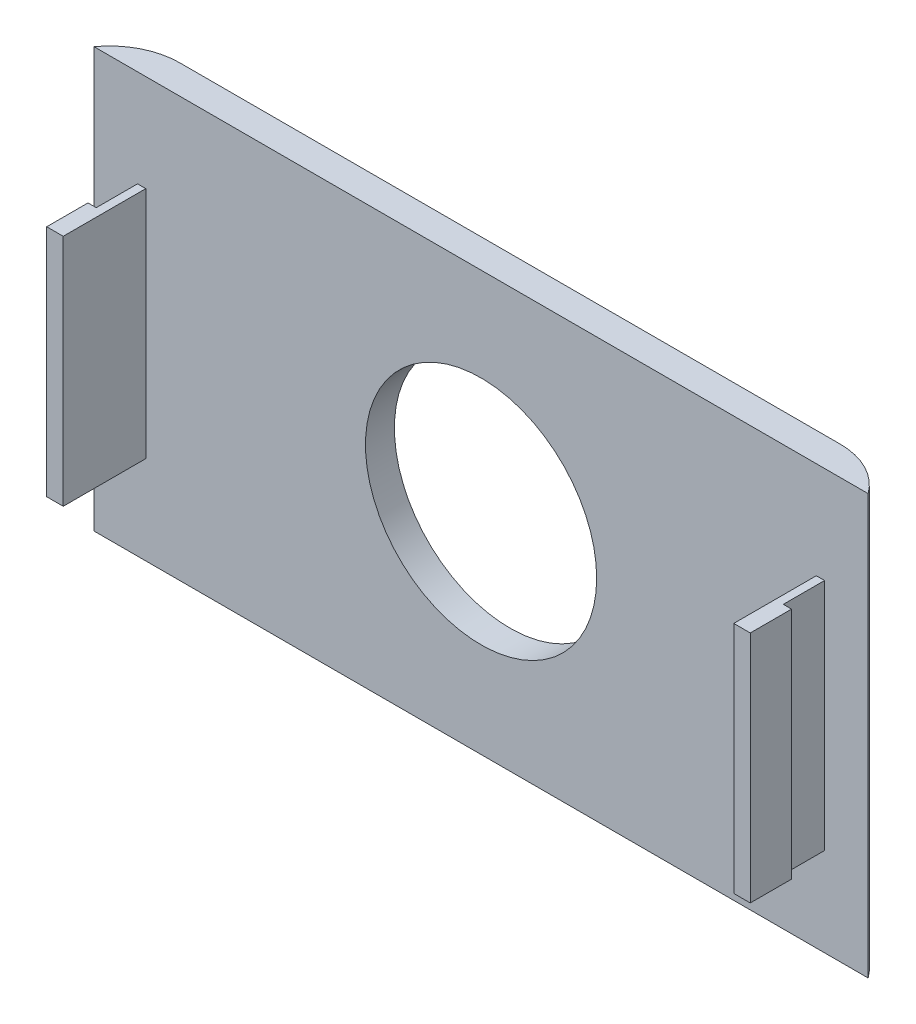
ISO-10303-21;
HEADER;
FILE_DESCRIPTION(('STEP AP214'),'2;1');
FILE_NAME('part.step','',(''),(''),'','','');
FILE_SCHEMA(('AUTOMOTIVE_DESIGN { 1 0 10303 214 1 1 1 1 }'));
ENDSEC;
DATA;
#1=APPLICATION_CONTEXT('core data for automotive mechanical design processes');
#2=APPLICATION_PROTOCOL_DEFINITION('international standard','automotive_design',2000,#1);
#3=PRODUCT_CONTEXT('',#1,'mechanical');
#4=PRODUCT('Part','Part','',(#3));
#5=PRODUCT_RELATED_PRODUCT_CATEGORY('part','',(#4));
#6=PRODUCT_DEFINITION_FORMATION('','',#4);
#7=PRODUCT_DEFINITION_CONTEXT('part definition',#1,'design');
#8=PRODUCT_DEFINITION('design','',#6,#7);
#9=PRODUCT_DEFINITION_SHAPE('','',#8);
#10=(LENGTH_UNIT() NAMED_UNIT(*) SI_UNIT(.MILLI.,.METRE.));
#11=(NAMED_UNIT(*) PLANE_ANGLE_UNIT() SI_UNIT($,.RADIAN.));
#12=(NAMED_UNIT(*) SI_UNIT($,.STERADIAN.) SOLID_ANGLE_UNIT());
#13=UNCERTAINTY_MEASURE_WITH_UNIT(LENGTH_MEASURE(1.E-05),#10,'distance_accuracy_value','');
#14=(GEOMETRIC_REPRESENTATION_CONTEXT(3) GLOBAL_UNCERTAINTY_ASSIGNED_CONTEXT((#13)) GLOBAL_UNIT_ASSIGNED_CONTEXT((#10,
#11,#12)) REPRESENTATION_CONTEXT('',''));
#15=CARTESIAN_POINT('',(0.,0.,0.));
#16=DIRECTION('',(0.,0.,1.));
#17=DIRECTION('',(1.,0.,0.));
#18=AXIS2_PLACEMENT_3D('',#15,#16,#17);
#19=CARTESIAN_POINT('',(-40.6,39.0508259488911,20.7509527022782));
#20=DIRECTION('',(0.,1.,0.));
#21=DIRECTION('',(0.,0.,1.));
#22=AXIS2_PLACEMENT_3D('',#19,#20,#21);
#23=PLANE('',#22);
#24=DIRECTION('',(0.,0.,1.));
#25=VECTOR('',#24,1.);
#26=CARTESIAN_POINT('',(-41.6,39.0508259488911,15.7509527022782));
#27=LINE('',#26,#25);
#28=CARTESIAN_POINT('',(-41.6,39.0508259488911,10.7509527022782));
#29=VERTEX_POINT('',#28);
#30=CARTESIAN_POINT('',(-41.6,39.0508259488911,15.7509527022782));
#31=VERTEX_POINT('',#30);
#32=EDGE_CURVE('E161',#29,#31,#27,.T.);
#33=ORIENTED_EDGE('',*,*,#32,.T.);
#34=DIRECTION('',(-1.,0.,0.));
#35=VECTOR('',#34,1.);
#36=CARTESIAN_POINT('',(-41.6,39.0508259488911,15.7509527022782));
#37=LINE('',#36,#35);
#38=CARTESIAN_POINT('',(-42.6,39.0508259488911,15.7509527022782));
#39=VERTEX_POINT('',#38);
#40=EDGE_CURVE('E147',#31,#39,#37,.T.);
#41=ORIENTED_EDGE('',*,*,#40,.T.);
#42=DIRECTION('',(0.,0.,-1.));
#43=VECTOR('',#42,1.);
#44=CARTESIAN_POINT('',(-42.5999999999999,39.0508259488911,20.7509527022782));
#45=LINE('',#44,#43);
#46=CARTESIAN_POINT('',(-42.5999999999999,39.0508259488911,20.7509527022782));
#47=VERTEX_POINT('',#46);
#48=EDGE_CURVE('E198',#47,#39,#45,.T.);
#49=ORIENTED_EDGE('',*,*,#48,.F.);
#50=DIRECTION('',(1.,0.,0.));
#51=VECTOR('',#50,1.);
#52=CARTESIAN_POINT('',(-40.6,39.0508259488911,20.7509527022782));
#53=LINE('',#52,#51);
#54=CARTESIAN_POINT('',(-40.6,39.0508259488911,20.7509527022782));
#55=VERTEX_POINT('',#54);
#56=EDGE_CURVE('E178',#47,#55,#53,.T.);
#57=ORIENTED_EDGE('',*,*,#56,.T.);
#58=DIRECTION('',(0.,0.,-1.));
#59=VECTOR('',#58,1.);
#60=CARTESIAN_POINT('',(-40.6,39.0508259488911,20.7509527022782));
#61=LINE('',#60,#59);
#62=CARTESIAN_POINT('',(-40.6,39.0508259488911,10.7509527022782));
#63=VERTEX_POINT('',#62);
#64=EDGE_CURVE('E200',#55,#63,#61,.T.);
#65=ORIENTED_EDGE('',*,*,#64,.T.);
#66=DIRECTION('',(1.,0.,0.));
#67=VECTOR('',#66,1.);
#68=CARTESIAN_POINT('',(-40.6,39.0508259488911,10.7509527022782));
#69=LINE('',#68,#67);
#70=EDGE_CURVE('E165',#29,#63,#69,.T.);
#71=ORIENTED_EDGE('',*,*,#70,.F.);
#72=EDGE_LOOP('',(#33,#41,#49,#57,#65,#71));
#73=FACE_BOUND('',#72,.T.);
#74=ADVANCED_FACE('F33',(#73),#23,.T.);
#75=CARTESIAN_POINT('',(-42.5999999999999,39.0508259488911,20.7509527022782));
#76=DIRECTION('',(-1.,0.,0.));
#77=DIRECTION('',(0.,0.,1.));
#78=AXIS2_PLACEMENT_3D('',#75,#76,#77);
#79=PLANE('',#78);
#80=ORIENTED_EDGE('',*,*,#48,.T.);
#81=DIRECTION('',(0.,-1.,0.));
#82=VECTOR('',#81,1.);
#83=CARTESIAN_POINT('',(-42.6,39.0508259488911,15.7509527022782));
#84=LINE('',#83,#82);
#85=CARTESIAN_POINT('',(-42.6,10.7314846602549,15.7509527022782));
#86=VERTEX_POINT('',#85);
#87=EDGE_CURVE('E153',#39,#86,#84,.T.);
#88=ORIENTED_EDGE('',*,*,#87,.T.);
#89=DIRECTION('',(0.,0.,-1.));
#90=VECTOR('',#89,1.);
#91=CARTESIAN_POINT('',(-42.5999999999999,10.7314846602549,20.7509527022782));
#92=LINE('',#91,#90);
#93=CARTESIAN_POINT('',(-42.5999999999999,10.7314846602549,20.7509527022782));
#94=VERTEX_POINT('',#93);
#95=EDGE_CURVE('E195',#94,#86,#92,.T.);
#96=ORIENTED_EDGE('',*,*,#95,.F.);
#97=DIRECTION('',(0.,1.,0.));
#98=VECTOR('',#97,1.);
#99=CARTESIAN_POINT('',(-42.5999999999999,39.0508259488911,20.7509527022782));
#100=LINE('',#99,#98);
#101=EDGE_CURVE('E182',#94,#47,#100,.T.);
#102=ORIENTED_EDGE('',*,*,#101,.T.);
#103=EDGE_LOOP('',(#80,#88,#96,#102));
#104=FACE_BOUND('',#103,.T.);
#105=ADVANCED_FACE('F303',(#104),#79,.T.);
#106=CARTESIAN_POINT('',(-40.6,10.7314846602549,20.7509527022782));
#107=DIRECTION('',(0.,-1.,0.));
#108=DIRECTION('',(0.,0.,-1.));
#109=AXIS2_PLACEMENT_3D('',#106,#107,#108);
#110=PLANE('',#109);
#111=ORIENTED_EDGE('',*,*,#95,.T.);
#112=DIRECTION('',(-1.,0.,0.));
#113=VECTOR('',#112,1.);
#114=CARTESIAN_POINT('',(-41.6,10.7314846602549,15.7509527022782));
#115=LINE('',#114,#113);
#116=CARTESIAN_POINT('',(-41.6,10.7314846602549,15.7509527022782));
#117=VERTEX_POINT('',#116);
#118=EDGE_CURVE('E157',#117,#86,#115,.T.);
#119=ORIENTED_EDGE('',*,*,#118,.F.);
#120=DIRECTION('',(0.,0.,-1.));
#121=VECTOR('',#120,1.);
#122=CARTESIAN_POINT('',(-41.6,10.7314846602549,15.7509527022782));
#123=LINE('',#122,#121);
#124=CARTESIAN_POINT('',(-41.6,10.7314846602549,10.7509527022782));
#125=VERTEX_POINT('',#124);
#126=EDGE_CURVE('E158',#117,#125,#123,.T.);
#127=ORIENTED_EDGE('',*,*,#126,.T.);
#128=DIRECTION('',(-1.,0.,0.));
#129=VECTOR('',#128,1.);
#130=CARTESIAN_POINT('',(-40.6,10.7314846602549,10.7509527022782));
#131=LINE('',#130,#129);
#132=CARTESIAN_POINT('',(-40.6,10.7314846602549,10.7509527022782));
#133=VERTEX_POINT('',#132);
#134=EDGE_CURVE('E179',#133,#125,#131,.T.);
#135=ORIENTED_EDGE('',*,*,#134,.F.);
#136=DIRECTION('',(0.,0.,-1.));
#137=VECTOR('',#136,1.);
#138=CARTESIAN_POINT('',(-40.6,10.7314846602549,20.7509527022782));
#139=LINE('',#138,#137);
#140=CARTESIAN_POINT('',(-40.6,10.7314846602549,20.7509527022782));
#141=VERTEX_POINT('',#140);
#142=EDGE_CURVE('E188',#141,#133,#139,.T.);
#143=ORIENTED_EDGE('',*,*,#142,.F.);
#144=DIRECTION('',(-1.,0.,0.));
#145=VECTOR('',#144,1.);
#146=CARTESIAN_POINT('',(-40.6,10.7314846602549,20.7509527022782));
#147=LINE('',#146,#145);
#148=EDGE_CURVE('E185',#141,#94,#147,.T.);
#149=ORIENTED_EDGE('',*,*,#148,.T.);
#150=EDGE_LOOP('',(#111,#119,#127,#135,#143,#149));
#151=FACE_BOUND('',#150,.T.);
#152=ADVANCED_FACE('F308',(#151),#110,.T.);
#153=CARTESIAN_POINT('',(-46.8745553102538,50.8,10.7509527022781));
#154=DIRECTION('',(0.,0.,-1.));
#155=DIRECTION('',(-1.,0.,0.));
#156=AXIS2_PLACEMENT_3D('',#153,#154,#155);
#157=PLANE('',#156);
#158=CARTESIAN_POINT('',(0.,25.5,10.7509527022781));
#159=DIRECTION('',(0.,0.,1.));
#160=DIRECTION('',(1.,0.,0.));
#161=AXIS2_PLACEMENT_3D('',#158,#159,#160);
#162=CIRCLE('',#161,14.);
#163=CARTESIAN_POINT('',(14.,25.5,10.7509527022781));
#164=VERTEX_POINT('',#163);
#165=EDGE_CURVE('E358',#164,#164,#162,.T.);
#166=ORIENTED_EDGE('',*,*,#165,.F.);
#167=EDGE_LOOP('',(#166));
#168=FACE_BOUND('',#167,.T.);
#169=DIRECTION('',(0.,1.,0.));
#170=VECTOR('',#169,1.);
#171=CARTESIAN_POINT('',(-41.6,39.0508259488911,10.7509527022782));
#172=LINE('',#171,#170);
#173=EDGE_CURVE('E48',#125,#29,#172,.T.);
#174=ORIENTED_EDGE('',*,*,#173,.T.);
#175=ORIENTED_EDGE('',*,*,#70,.T.);
#176=DIRECTION('',(0.,-1.,0.));
#177=VECTOR('',#176,1.);
#178=CARTESIAN_POINT('',(-40.6,39.0508259488911,10.7509527022782));
#179=LINE('',#178,#177);
#180=EDGE_CURVE('E173',#63,#133,#179,.T.);
#181=ORIENTED_EDGE('',*,*,#180,.T.);
#182=ORIENTED_EDGE('',*,*,#134,.T.);
#183=EDGE_LOOP('',(#174,#175,#181,#182));
#184=FACE_BOUND('',#183,.T.);
#185=DIRECTION('',(1.,0.,0.));
#186=VECTOR('',#185,1.);
#187=CARTESIAN_POINT('',(-46.8745553102538,0.,10.7509527022781));
#188=LINE('',#187,#186);
#189=CARTESIAN_POINT('',(-46.8745553102538,0.,10.7509527022781));
#190=VERTEX_POINT('',#189);
#191=CARTESIAN_POINT('',(46.8745553102538,0.,10.7509527022781));
#192=VERTEX_POINT('',#191);
#193=EDGE_CURVE('E251',#190,#192,#188,.T.);
#194=ORIENTED_EDGE('',*,*,#193,.T.);
#195=DIRECTION('',(0.,-1.,0.));
#196=VECTOR('',#195,1.);
#197=CARTESIAN_POINT('',(46.8745553102538,50.8,10.7509527022781));
#198=LINE('',#197,#196);
#199=CARTESIAN_POINT('',(46.8745553102538,50.8,10.7509527022781));
#200=VERTEX_POINT('',#199);
#201=EDGE_CURVE('E257',#200,#192,#198,.T.);
#202=ORIENTED_EDGE('',*,*,#201,.F.);
#203=DIRECTION('',(1.,0.,0.));
#204=VECTOR('',#203,1.);
#205=CARTESIAN_POINT('',(-46.8745553102538,50.8,10.7509527022781));
#206=LINE('',#205,#204);
#207=CARTESIAN_POINT('',(-46.8745553102538,50.8,10.7509527022781));
#208=VERTEX_POINT('',#207);
#209=EDGE_CURVE('E255',#208,#200,#206,.T.);
#210=ORIENTED_EDGE('',*,*,#209,.F.);
#211=DIRECTION('',(0.,-1.,0.));
#212=VECTOR('',#211,1.);
#213=CARTESIAN_POINT('',(-46.8745553102538,50.8,10.7509527022781));
#214=LINE('',#213,#212);
#215=EDGE_CURVE('E267',#208,#190,#214,.T.);
#216=ORIENTED_EDGE('',*,*,#215,.T.);
#217=EDGE_LOOP('',(#194,#202,#210,#216));
#218=FACE_BOUND('',#217,.T.);
#219=DIRECTION('',(0.,-1.,0.));
#220=VECTOR('',#219,1.);
#221=CARTESIAN_POINT('',(40.6,39.0508259488911,10.7509527022781));
#222=LINE('',#221,#220);
#223=CARTESIAN_POINT('',(40.6,39.0508259488911,10.7509527022781));
#224=VERTEX_POINT('',#223);
#225=CARTESIAN_POINT('',(40.6,10.7314846602549,10.7509527022781));
#226=VERTEX_POINT('',#225);
#227=EDGE_CURVE('E215',#224,#226,#222,.T.);
#228=ORIENTED_EDGE('',*,*,#227,.F.);
#229=DIRECTION('',(-1.,0.,0.));
#230=VECTOR('',#229,1.);
#231=CARTESIAN_POINT('',(40.6,39.0508259488911,10.7509527022781));
#232=LINE('',#231,#230);
#233=CARTESIAN_POINT('',(41.6,39.0508259488911,10.7509527022781));
#234=VERTEX_POINT('',#233);
#235=EDGE_CURVE('E222',#234,#224,#232,.T.);
#236=ORIENTED_EDGE('',*,*,#235,.F.);
#237=DIRECTION('',(0.,1.,0.));
#238=VECTOR('',#237,1.);
#239=CARTESIAN_POINT('',(41.6,39.0508259488911,10.7509527022781));
#240=LINE('',#239,#238);
#241=CARTESIAN_POINT('',(41.6,10.7314846602549,10.7509527022781));
#242=VERTEX_POINT('',#241);
#243=EDGE_CURVE('E56',#242,#234,#240,.T.);
#244=ORIENTED_EDGE('',*,*,#243,.F.);
#245=DIRECTION('',(1.,0.,0.));
#246=VECTOR('',#245,1.);
#247=CARTESIAN_POINT('',(40.6,10.7314846602549,10.7509527022781));
#248=LINE('',#247,#246);
#249=EDGE_CURVE('E231',#226,#242,#248,.T.);
#250=ORIENTED_EDGE('',*,*,#249,.F.);
#251=EDGE_LOOP('',(#228,#236,#244,#250));
#252=FACE_BOUND('',#251,.T.);
#253=ADVANCED_FACE('F283',(#168,#184,#218,#252),#157,.F.);
#254=CARTESIAN_POINT('',(40.,50.8,15.7500005704625));
#255=DIRECTION('',(0.,-1.,0.));
#256=DIRECTION('',(0.,0.,-1.));
#257=AXIS2_PLACEMENT_3D('',#254,#255,#256);
#258=CYLINDRICAL_SURFACE('',#257,8.49999942953751);
#259=CARTESIAN_POINT('',(40.,0.,15.7500005704625));
#260=DIRECTION('',(0.,1.,0.));
#261=DIRECTION('',(0.,0.,1.));
#262=AXIS2_PLACEMENT_3D('',#259,#260,#261);
#263=CIRCLE('',#262,8.49999942953751);
#264=CARTESIAN_POINT('',(40.,0.,7.25000114092498));
#265=VERTEX_POINT('',#264);
#266=EDGE_CURVE('E246',#192,#265,#263,.T.);
#267=ORIENTED_EDGE('',*,*,#266,.T.);
#268=DIRECTION('',(0.,-1.,0.));
#269=VECTOR('',#268,1.);
#270=CARTESIAN_POINT('',(40.,50.8,7.25000114092498));
#271=LINE('',#270,#269);
#272=CARTESIAN_POINT('',(40.,50.8,7.25000114092498));
#273=VERTEX_POINT('',#272);
#274=EDGE_CURVE('E11',#273,#265,#271,.T.);
#275=ORIENTED_EDGE('',*,*,#274,.F.);
#276=CARTESIAN_POINT('',(40.,50.8,15.7500005704625));
#277=DIRECTION('',(0.,1.,0.));
#278=DIRECTION('',(0.,0.,1.));
#279=AXIS2_PLACEMENT_3D('',#276,#277,#278);
#280=CIRCLE('',#279,8.49999942953751);
#281=EDGE_CURVE('E247',#200,#273,#280,.T.);
#282=ORIENTED_EDGE('',*,*,#281,.F.);
#283=ORIENTED_EDGE('',*,*,#201,.T.);
#284=EDGE_LOOP('',(#267,#275,#282,#283));
#285=FACE_BOUND('',#284,.T.);
#286=ADVANCED_FACE('F35',(#285),#258,.T.);
#287=CARTESIAN_POINT('',(-40.,50.8,7.25000114092498));
#288=DIRECTION('',(0.,0.,1.));
#289=DIRECTION('',(1.,0.,0.));
#290=AXIS2_PLACEMENT_3D('',#287,#288,#289);
#291=PLANE('',#290);
#292=CARTESIAN_POINT('',(0.,25.5,7.25000114092498));
#293=DIRECTION('',(0.,0.,1.));
#294=DIRECTION('',(1.,0.,0.));
#295=AXIS2_PLACEMENT_3D('',#292,#293,#294);
#296=CIRCLE('',#295,14.);
#297=CARTESIAN_POINT('',(14.,25.5,7.25000114092498));
#298=VERTEX_POINT('',#297);
#299=EDGE_CURVE('E172',#298,#298,#296,.T.);
#300=ORIENTED_EDGE('',*,*,#299,.T.);
#301=EDGE_LOOP('',(#300));
#302=FACE_BOUND('',#301,.T.);
#303=DIRECTION('',(-1.,0.,0.));
#304=VECTOR('',#303,1.);
#305=CARTESIAN_POINT('',(-40.,0.,7.25000114092498));
#306=LINE('',#305,#304);
#307=CARTESIAN_POINT('',(-40.,0.,7.25000114092498));
#308=VERTEX_POINT('',#307);
#309=EDGE_CURVE('E260',#265,#308,#306,.T.);
#310=ORIENTED_EDGE('',*,*,#309,.T.);
#311=DIRECTION('',(0.,-1.,0.));
#312=VECTOR('',#311,1.);
#313=CARTESIAN_POINT('',(-40.,50.8,7.25000114092498));
#314=LINE('',#313,#312);
#315=CARTESIAN_POINT('',(-40.,50.8,7.25000114092498));
#316=VERTEX_POINT('',#315);
#317=EDGE_CURVE('E41',#316,#308,#314,.T.);
#318=ORIENTED_EDGE('',*,*,#317,.F.);
#319=DIRECTION('',(-1.,0.,0.));
#320=VECTOR('',#319,1.);
#321=CARTESIAN_POINT('',(-40.,50.8,7.25000114092498));
#322=LINE('',#321,#320);
#323=EDGE_CURVE('E250',#273,#316,#322,.T.);
#324=ORIENTED_EDGE('',*,*,#323,.F.);
#325=ORIENTED_EDGE('',*,*,#274,.T.);
#326=EDGE_LOOP('',(#310,#318,#324,#325));
#327=FACE_BOUND('',#326,.T.);
#328=ADVANCED_FACE('F291',(#302,#327),#291,.F.);
#329=CARTESIAN_POINT('',(-40.,50.8,15.7500005704625));
#330=DIRECTION('',(0.,-1.,0.));
#331=DIRECTION('',(0.,0.,-1.));
#332=AXIS2_PLACEMENT_3D('',#329,#330,#331);
#333=CYLINDRICAL_SURFACE('',#332,8.49999942953751);
#334=CARTESIAN_POINT('',(-40.,0.,15.7500005704625));
#335=DIRECTION('',(0.,1.,0.));
#336=DIRECTION('',(0.,0.,-1.));
#337=AXIS2_PLACEMENT_3D('',#334,#335,#336);
#338=CIRCLE('',#337,8.49999942953751);
#339=EDGE_CURVE('E262',#308,#190,#338,.T.);
#340=ORIENTED_EDGE('',*,*,#339,.T.);
#341=ORIENTED_EDGE('',*,*,#215,.F.);
#342=CARTESIAN_POINT('',(-40.,50.8,15.7500005704625));
#343=DIRECTION('',(0.,1.,0.));
#344=DIRECTION('',(0.,0.,-1.));
#345=AXIS2_PLACEMENT_3D('',#342,#343,#344);
#346=CIRCLE('',#345,8.49999942953751);
#347=EDGE_CURVE('E253',#316,#208,#346,.T.);
#348=ORIENTED_EDGE('',*,*,#347,.F.);
#349=ORIENTED_EDGE('',*,*,#317,.T.);
#350=EDGE_LOOP('',(#340,#341,#348,#349));
#351=FACE_BOUND('',#350,.T.);
#352=ADVANCED_FACE('F274',(#351),#333,.T.);
#353=CARTESIAN_POINT('',(40.,50.8,15.7500005704625));
#354=DIRECTION('',(0.,1.,0.));
#355=DIRECTION('',(0.,0.,1.));
#356=AXIS2_PLACEMENT_3D('',#353,#354,#355);
#357=PLANE('',#356);
#358=ORIENTED_EDGE('',*,*,#281,.T.);
#359=ORIENTED_EDGE('',*,*,#323,.T.);
#360=ORIENTED_EDGE('',*,*,#347,.T.);
#361=ORIENTED_EDGE('',*,*,#209,.T.);
#362=EDGE_LOOP('',(#358,#359,#360,#361));
#363=FACE_BOUND('',#362,.T.);
#364=ADVANCED_FACE('F290',(#363),#357,.T.);
#365=CARTESIAN_POINT('',(40.,0.,15.7500005704625));
#366=DIRECTION('',(0.,1.,0.));
#367=DIRECTION('',(0.,0.,1.));
#368=AXIS2_PLACEMENT_3D('',#365,#366,#367);
#369=PLANE('',#368);
#370=ORIENTED_EDGE('',*,*,#266,.F.);
#371=ORIENTED_EDGE('',*,*,#193,.F.);
#372=ORIENTED_EDGE('',*,*,#339,.F.);
#373=ORIENTED_EDGE('',*,*,#309,.F.);
#374=EDGE_LOOP('',(#370,#371,#372,#373));
#375=FACE_BOUND('',#374,.T.);
#376=ADVANCED_FACE('F280',(#375),#369,.F.);
#377=CARTESIAN_POINT('',(40.6,39.0508259488911,20.7509527022781));
#378=DIRECTION('',(1.,0.,0.));
#379=DIRECTION('',(0.,1.,0.));
#380=AXIS2_PLACEMENT_3D('',#377,#378,#379);
#381=PLANE('',#380);
#382=ORIENTED_EDGE('',*,*,#227,.T.);
#383=DIRECTION('',(0.,0.,-1.));
#384=VECTOR('',#383,1.);
#385=CARTESIAN_POINT('',(40.6,10.7314846602549,20.7509527022781));
#386=LINE('',#385,#384);
#387=CARTESIAN_POINT('',(40.6,10.7314846602549,20.7509527022781));
#388=VERTEX_POINT('',#387);
#389=EDGE_CURVE('E243',#388,#226,#386,.T.);
#390=ORIENTED_EDGE('',*,*,#389,.F.);
#391=DIRECTION('',(0.,-1.,0.));
#392=VECTOR('',#391,1.);
#393=CARTESIAN_POINT('',(40.6,39.0508259488911,20.7509527022781));
#394=LINE('',#393,#392);
#395=CARTESIAN_POINT('',(40.6,39.0508259488911,20.7509527022781));
#396=VERTEX_POINT('',#395);
#397=EDGE_CURVE('E218',#396,#388,#394,.T.);
#398=ORIENTED_EDGE('',*,*,#397,.F.);
#399=DIRECTION('',(0.,0.,-1.));
#400=VECTOR('',#399,1.);
#401=CARTESIAN_POINT('',(40.6,39.0508259488911,20.7509527022781));
#402=LINE('',#401,#400);
#403=EDGE_CURVE('E228',#396,#224,#402,.T.);
#404=ORIENTED_EDGE('',*,*,#403,.T.);
#405=EDGE_LOOP('',(#382,#390,#398,#404));
#406=FACE_BOUND('',#405,.T.);
#407=ADVANCED_FACE('F340',(#406),#381,.F.);
#408=CARTESIAN_POINT('',(40.6,10.7314846602549,20.7509527022781));
#409=DIRECTION('',(0.,1.,0.));
#410=DIRECTION('',(0.,0.,1.));
#411=AXIS2_PLACEMENT_3D('',#408,#409,#410);
#412=PLANE('',#411);
#413=DIRECTION('',(0.,0.,-1.));
#414=VECTOR('',#413,1.);
#415=CARTESIAN_POINT('',(41.6,10.7314846602549,15.7509527022781));
#416=LINE('',#415,#414);
#417=CARTESIAN_POINT('',(41.6,10.7314846602549,15.7509527022781));
#418=VERTEX_POINT('',#417);
#419=EDGE_CURVE('E206',#418,#242,#416,.T.);
#420=ORIENTED_EDGE('',*,*,#419,.F.);
#421=DIRECTION('',(1.,0.,0.));
#422=VECTOR('',#421,1.);
#423=CARTESIAN_POINT('',(41.6,10.7314846602549,15.7509527022781));
#424=LINE('',#423,#422);
#425=CARTESIAN_POINT('',(42.6,10.7314846602549,15.7509527022781));
#426=VERTEX_POINT('',#425);
#427=EDGE_CURVE('E211',#418,#426,#424,.T.);
#428=ORIENTED_EDGE('',*,*,#427,.T.);
#429=DIRECTION('',(0.,0.,-1.));
#430=VECTOR('',#429,1.);
#431=CARTESIAN_POINT('',(42.6,10.7314846602549,20.7509527022781));
#432=LINE('',#431,#430);
#433=CARTESIAN_POINT('',(42.6,10.7314846602549,20.7509527022781));
#434=VERTEX_POINT('',#433);
#435=EDGE_CURVE('E240',#434,#426,#432,.T.);
#436=ORIENTED_EDGE('',*,*,#435,.F.);
#437=DIRECTION('',(1.,0.,0.));
#438=VECTOR('',#437,1.);
#439=CARTESIAN_POINT('',(40.6,10.7314846602549,20.7509527022781));
#440=LINE('',#439,#438);
#441=EDGE_CURVE('E221',#388,#434,#440,.T.);
#442=ORIENTED_EDGE('',*,*,#441,.F.);
#443=ORIENTED_EDGE('',*,*,#389,.T.);
#444=ORIENTED_EDGE('',*,*,#249,.T.);
#445=EDGE_LOOP('',(#420,#428,#436,#442,#443,#444));
#446=FACE_BOUND('',#445,.T.);
#447=ADVANCED_FACE('F336',(#446),#412,.F.);
#448=CARTESIAN_POINT('',(42.6,39.0508259488911,20.7509527022781));
#449=DIRECTION('',(-1.,0.,0.));
#450=DIRECTION('',(0.,0.,1.));
#451=AXIS2_PLACEMENT_3D('',#448,#449,#450);
#452=PLANE('',#451);
#453=ORIENTED_EDGE('',*,*,#435,.T.);
#454=DIRECTION('',(0.,-1.,0.));
#455=VECTOR('',#454,1.);
#456=CARTESIAN_POINT('',(42.6,39.0508259488911,15.7509527022781));
#457=LINE('',#456,#455);
#458=CARTESIAN_POINT('',(42.6,39.0508259488911,15.7509527022781));
#459=VERTEX_POINT('',#458);
#460=EDGE_CURVE('E202',#459,#426,#457,.T.);
#461=ORIENTED_EDGE('',*,*,#460,.F.);
#462=DIRECTION('',(0.,0.,-1.));
#463=VECTOR('',#462,1.);
#464=CARTESIAN_POINT('',(42.6,39.0508259488911,20.7509527022781));
#465=LINE('',#464,#463);
#466=CARTESIAN_POINT('',(42.6,39.0508259488911,20.7509527022781));
#467=VERTEX_POINT('',#466);
#468=EDGE_CURVE('E237',#467,#459,#465,.T.);
#469=ORIENTED_EDGE('',*,*,#468,.F.);
#470=DIRECTION('',(0.,1.,0.));
#471=VECTOR('',#470,1.);
#472=CARTESIAN_POINT('',(42.6,39.0508259488911,20.7509527022781));
#473=LINE('',#472,#471);
#474=EDGE_CURVE('E224',#434,#467,#473,.T.);
#475=ORIENTED_EDGE('',*,*,#474,.F.);
#476=EDGE_LOOP('',(#453,#461,#469,#475));
#477=FACE_BOUND('',#476,.T.);
#478=ADVANCED_FACE('F332',(#477),#452,.F.);
#479=CARTESIAN_POINT('',(40.6,39.0508259488911,20.7509527022781));
#480=DIRECTION('',(0.,-1.,0.));
#481=DIRECTION('',(0.,0.,-1.));
#482=AXIS2_PLACEMENT_3D('',#479,#480,#481);
#483=PLANE('',#482);
#484=ORIENTED_EDGE('',*,*,#468,.T.);
#485=DIRECTION('',(1.,0.,0.));
#486=VECTOR('',#485,1.);
#487=CARTESIAN_POINT('',(41.6,39.0508259488911,15.7509527022781));
#488=LINE('',#487,#486);
#489=CARTESIAN_POINT('',(41.6,39.0508259488911,15.7509527022781));
#490=VERTEX_POINT('',#489);
#491=EDGE_CURVE('E213',#490,#459,#488,.T.);
#492=ORIENTED_EDGE('',*,*,#491,.F.);
#493=DIRECTION('',(0.,0.,1.));
#494=VECTOR('',#493,1.);
#495=CARTESIAN_POINT('',(41.6,39.0508259488911,15.7509527022781));
#496=LINE('',#495,#494);
#497=EDGE_CURVE('E209',#234,#490,#496,.T.);
#498=ORIENTED_EDGE('',*,*,#497,.F.);
#499=ORIENTED_EDGE('',*,*,#235,.T.);
#500=ORIENTED_EDGE('',*,*,#403,.F.);
#501=DIRECTION('',(-1.,0.,0.));
#502=VECTOR('',#501,1.);
#503=CARTESIAN_POINT('',(40.6,39.0508259488911,20.7509527022781));
#504=LINE('',#503,#502);
#505=EDGE_CURVE('E226',#467,#396,#504,.T.);
#506=ORIENTED_EDGE('',*,*,#505,.F.);
#507=EDGE_LOOP('',(#484,#492,#498,#499,#500,#506));
#508=FACE_BOUND('',#507,.T.);
#509=ADVANCED_FACE('F328',(#508),#483,.F.);
#510=CARTESIAN_POINT('',(0.,0.,20.7509527022781));
#511=DIRECTION('',(0.,0.,1.));
#512=DIRECTION('',(1.,0.,0.));
#513=AXIS2_PLACEMENT_3D('',#510,#511,#512);
#514=PLANE('',#513);
#515=ORIENTED_EDGE('',*,*,#397,.T.);
#516=ORIENTED_EDGE('',*,*,#441,.T.);
#517=ORIENTED_EDGE('',*,*,#474,.T.);
#518=ORIENTED_EDGE('',*,*,#505,.T.);
#519=EDGE_LOOP('',(#515,#516,#517,#518));
#520=FACE_BOUND('',#519,.T.);
#521=ADVANCED_FACE('F324',(#520),#514,.T.);
#522=CARTESIAN_POINT('',(41.6,39.0508259488911,15.7509527022781));
#523=DIRECTION('',(0.,0.,1.));
#524=DIRECTION('',(1.,0.,0.));
#525=AXIS2_PLACEMENT_3D('',#522,#523,#524);
#526=PLANE('',#525);
#527=ORIENTED_EDGE('',*,*,#460,.T.);
#528=ORIENTED_EDGE('',*,*,#427,.F.);
#529=DIRECTION('',(0.,-1.,0.));
#530=VECTOR('',#529,1.);
#531=CARTESIAN_POINT('',(41.6,39.0508259488911,15.7509527022781));
#532=LINE('',#531,#530);
#533=EDGE_CURVE('E203',#490,#418,#532,.T.);
#534=ORIENTED_EDGE('',*,*,#533,.F.);
#535=ORIENTED_EDGE('',*,*,#491,.T.);
#536=EDGE_LOOP('',(#527,#528,#534,#535));
#537=FACE_BOUND('',#536,.T.);
#538=ADVANCED_FACE('F321',(#537),#526,.F.);
#539=CARTESIAN_POINT('',(41.6,0.,0.));
#540=DIRECTION('',(1.,0.,0.));
#541=DIRECTION('',(0.,0.,-1.));
#542=AXIS2_PLACEMENT_3D('',#539,#540,#541);
#543=PLANE('',#542);
#544=ORIENTED_EDGE('',*,*,#533,.T.);
#545=ORIENTED_EDGE('',*,*,#419,.T.);
#546=ORIENTED_EDGE('',*,*,#243,.T.);
#547=ORIENTED_EDGE('',*,*,#497,.T.);
#548=EDGE_LOOP('',(#544,#545,#546,#547));
#549=FACE_BOUND('',#548,.T.);
#550=ADVANCED_FACE('F317',(#549),#543,.T.);
#551=CARTESIAN_POINT('',(-40.6,39.0508259488911,20.7509527022782));
#552=DIRECTION('',(1.,0.,0.));
#553=DIRECTION('',(0.,0.,-1.));
#554=AXIS2_PLACEMENT_3D('',#551,#552,#553);
#555=PLANE('',#554);
#556=ORIENTED_EDGE('',*,*,#180,.F.);
#557=ORIENTED_EDGE('',*,*,#64,.F.);
#558=DIRECTION('',(0.,-1.,0.));
#559=VECTOR('',#558,1.);
#560=CARTESIAN_POINT('',(-40.6,39.0508259488911,20.7509527022782));
#561=LINE('',#560,#559);
#562=EDGE_CURVE('E175',#55,#141,#561,.T.);
#563=ORIENTED_EDGE('',*,*,#562,.T.);
#564=ORIENTED_EDGE('',*,*,#142,.T.);
#565=EDGE_LOOP('',(#556,#557,#563,#564));
#566=FACE_BOUND('',#565,.T.);
#567=ADVANCED_FACE('F313',(#566),#555,.T.);
#568=CARTESIAN_POINT('',(0.,0.,20.7509527022781));
#569=DIRECTION('',(0.,0.,1.));
#570=DIRECTION('',(-1.,0.,0.));
#571=AXIS2_PLACEMENT_3D('',#568,#569,#570);
#572=PLANE('',#571);
#573=ORIENTED_EDGE('',*,*,#562,.F.);
#574=ORIENTED_EDGE('',*,*,#56,.F.);
#575=ORIENTED_EDGE('',*,*,#101,.F.);
#576=ORIENTED_EDGE('',*,*,#148,.F.);
#577=EDGE_LOOP('',(#573,#574,#575,#576));
#578=FACE_BOUND('',#577,.T.);
#579=ADVANCED_FACE('F316',(#578),#572,.T.);
#580=CARTESIAN_POINT('',(-41.6,39.0508259488911,15.7509527022782));
#581=DIRECTION('',(0.,0.,-1.));
#582=DIRECTION('',(-1.,0.,0.));
#583=AXIS2_PLACEMENT_3D('',#580,#581,#582);
#584=PLANE('',#583);
#585=ORIENTED_EDGE('',*,*,#87,.F.);
#586=ORIENTED_EDGE('',*,*,#40,.F.);
#587=DIRECTION('',(0.,-1.,0.));
#588=VECTOR('',#587,1.);
#589=CARTESIAN_POINT('',(-41.6,39.0508259488911,15.7509527022782));
#590=LINE('',#589,#588);
#591=EDGE_CURVE('E150',#31,#117,#590,.T.);
#592=ORIENTED_EDGE('',*,*,#591,.T.);
#593=ORIENTED_EDGE('',*,*,#118,.T.);
#594=EDGE_LOOP('',(#585,#586,#592,#593));
#595=FACE_BOUND('',#594,.T.);
#596=ADVANCED_FACE('F149',(#595),#584,.T.);
#597=CARTESIAN_POINT('',(-41.6,0.,1.07119668199419E-13));
#598=DIRECTION('',(-1.,0.,0.));
#599=DIRECTION('',(0.,0.,-1.));
#600=AXIS2_PLACEMENT_3D('',#597,#598,#599);
#601=PLANE('',#600);
#602=ORIENTED_EDGE('',*,*,#591,.F.);
#603=ORIENTED_EDGE('',*,*,#32,.F.);
#604=ORIENTED_EDGE('',*,*,#173,.F.);
#605=ORIENTED_EDGE('',*,*,#126,.F.);
#606=EDGE_LOOP('',(#602,#603,#604,#605));
#607=FACE_BOUND('',#606,.T.);
#608=ADVANCED_FACE('F160',(#607),#601,.T.);
#609=CARTESIAN_POINT('',(0.,25.5,7.25000114092498));
#610=DIRECTION('',(0.,0.,1.));
#611=DIRECTION('',(1.,0.,0.));
#612=AXIS2_PLACEMENT_3D('',#609,#610,#611);
#613=CYLINDRICAL_SURFACE('',#612,14.);
#614=CARTESIAN_POINT('',(14.,25.5,7.25000114092498));
#615=CARTESIAN_POINT('',(14.,25.5,7.28646938635574));
#616=CARTESIAN_POINT('',(14.,25.5,7.3229376317865));
#617=CARTESIAN_POINT('',(14.,25.5,7.39587412264802));
#618=CARTESIAN_POINT('',(14.,25.5,7.43234236807879));
#619=CARTESIAN_POINT('',(14.,25.5,7.50527885894031));
#620=CARTESIAN_POINT('',(14.,25.5,7.54174710437107));
#621=CARTESIAN_POINT('',(14.,25.5,7.61468359523259));
#622=CARTESIAN_POINT('',(14.,25.5,7.65115184066335));
#623=CARTESIAN_POINT('',(14.,25.5,7.72408833152488));
#624=CARTESIAN_POINT('',(14.,25.5,7.76055657695564));
#625=CARTESIAN_POINT('',(14.,25.5,7.83349306781716));
#626=CARTESIAN_POINT('',(14.,25.5,7.86996131324792));
#627=CARTESIAN_POINT('',(14.,25.5,7.94289780410945));
#628=CARTESIAN_POINT('',(14.,25.5,7.97936604954021));
#629=CARTESIAN_POINT('',(14.,25.5,8.05230254040173));
#630=CARTESIAN_POINT('',(14.,25.5,8.08877078583249));
#631=CARTESIAN_POINT('',(14.,25.5,8.16170727669402));
#632=CARTESIAN_POINT('',(14.,25.5,8.19817552212478));
#633=CARTESIAN_POINT('',(14.,25.5,8.2711120129863));
#634=CARTESIAN_POINT('',(14.,25.5,8.30758025841706));
#635=CARTESIAN_POINT('',(14.,25.5,8.38051674927858));
#636=CARTESIAN_POINT('',(14.,25.5,8.41698499470935));
#637=CARTESIAN_POINT('',(14.,25.5,8.48992148557087));
#638=CARTESIAN_POINT('',(14.,25.5,8.52638973100163));
#639=CARTESIAN_POINT('',(14.,25.5,8.59932622186315));
#640=CARTESIAN_POINT('',(14.,25.5,8.63579446729391));
#641=CARTESIAN_POINT('',(14.,25.5,8.70873095815544));
#642=CARTESIAN_POINT('',(14.,25.5,8.7451992035862));
#643=CARTESIAN_POINT('',(14.,25.5,8.81813569444772));
#644=CARTESIAN_POINT('',(14.,25.5,8.85460393987848));
#645=CARTESIAN_POINT('',(14.,25.5,8.92754043074001));
#646=CARTESIAN_POINT('',(14.,25.5,8.96400867617077));
#647=CARTESIAN_POINT('',(14.,25.5,9.03694516703229));
#648=CARTESIAN_POINT('',(14.,25.5,9.07341341246305));
#649=CARTESIAN_POINT('',(14.,25.5,9.14634990332458));
#650=CARTESIAN_POINT('',(14.,25.5,9.18281814875534));
#651=CARTESIAN_POINT('',(14.,25.5,9.25575463961686));
#652=CARTESIAN_POINT('',(14.,25.5,9.29222288504762));
#653=CARTESIAN_POINT('',(14.,25.5,9.36515937590915));
#654=CARTESIAN_POINT('',(14.,25.5,9.40162762133991));
#655=CARTESIAN_POINT('',(14.,25.5,9.47456411220143));
#656=CARTESIAN_POINT('',(14.,25.5,9.51103235763219));
#657=CARTESIAN_POINT('',(14.,25.5,9.58396884849371));
#658=CARTESIAN_POINT('',(14.,25.5,9.62043709392447));
#659=CARTESIAN_POINT('',(14.,25.5,9.693373584786));
#660=CARTESIAN_POINT('',(14.,25.5,9.72984183021676));
#661=CARTESIAN_POINT('',(14.,25.5,9.80277832107828));
#662=CARTESIAN_POINT('',(14.,25.5,9.83924656650904));
#663=CARTESIAN_POINT('',(14.,25.5,9.91218305737057));
#664=CARTESIAN_POINT('',(14.,25.5,9.94865130280133));
#665=CARTESIAN_POINT('',(14.,25.5,10.0215877936629));
#666=CARTESIAN_POINT('',(14.,25.5,10.0580560390936));
#667=CARTESIAN_POINT('',(14.,25.5,10.1309925299551));
#668=CARTESIAN_POINT('',(14.,25.5,10.1674607753859));
#669=CARTESIAN_POINT('',(14.,25.5,10.2403972662474));
#670=CARTESIAN_POINT('',(14.,25.5,10.2768655116782));
#671=CARTESIAN_POINT('',(14.,25.5,10.3498020025397));
#672=CARTESIAN_POINT('',(14.,25.5,10.3862702479705));
#673=CARTESIAN_POINT('',(14.,25.5,10.459206738832));
#674=CARTESIAN_POINT('',(14.,25.5,10.4956749842628));
#675=CARTESIAN_POINT('',(14.,25.5,10.5686114751243));
#676=CARTESIAN_POINT('',(14.,25.5,10.605079720555));
#677=CARTESIAN_POINT('',(14.,25.5,10.6780162114166));
#678=CARTESIAN_POINT('',(14.,25.5,10.7144844568473));
#679=CARTESIAN_POINT('',(14.,25.5,10.7509527022781));
#680=B_SPLINE_CURVE_WITH_KNOTS('',3,(#614,#615,#616,#617,#618,#619,#620,#621,#622,#623,#624,
#625,#626,#627,#628,#629,#630,#631,#632,#633,#634,#635,#636,#637,#638,#639,#640,#641,#642,#643,
#644,#645,#646,#647,#648,#649,#650,#651,#652,#653,#654,#655,#656,#657,#658,#659,#660,#661,#662,
#663,#664,#665,#666,#667,#668,#669,#670,#671,#672,#673,#674,#675,#676,#677,#678,#679),
.UNSPECIFIED.,.F.,.F.,(4,2,2,2,2,2,2,2,2,2,2,2,2,2,2,2,2,2,2,2,2,2,2,2,2,2,2,2,2,2,2,2,4),(0.,
0.109404736292285,0.218809472584569,0.328214208876854,0.437618945169138,0.547023681461423,
0.656428417753707,0.765833154045992,0.875237890338276,0.984642626630561,1.09404736292285,
1.20345209921513,1.31285683550741,1.4222615717997,1.53166630809198,1.64107104438427,
1.75047578067655,1.85988051696884,1.96928525326112,2.07868998955341,2.18809472584569,
2.29749946213798,2.40690419843026,2.51630893472254,2.62571367101483,2.73511840730711,
2.8445231435994,2.95392787989168,3.06333261618397,3.17273735247625,3.28214208876854,
3.39154682506082,3.50095156135311),.UNSPECIFIED.);
#681=EDGE_CURVE('BSEAM375',#298,#164,#680,.T.);
#682=ORIENTED_EDGE('',*,*,#299,.F.);
#683=ORIENTED_EDGE('',*,*,#165,.T.);
#684=ORIENTED_EDGE('',*,*,#681,.T.);
#685=ORIENTED_EDGE('',*,*,#681,.F.);
#686=EDGE_LOOP('',(#682,#684,#683,#685));
#687=FACE_BOUND('',#686,.T.);
#688=ADVANCED_FACE('F375',(#687),#613,.F.);
#689=CLOSED_SHELL('',(#74,#105,#152,#253,#286,#328,#352,#364,#376,#407,#447,#478,#509,#521,#538,
#550,#567,#579,#596,#608,#688));
#690=MANIFOLD_SOLID_BREP('B2',#689);
#691=ADVANCED_BREP_SHAPE_REPRESENTATION('',(#18,#690),#14);
#692=SHAPE_DEFINITION_REPRESENTATION(#9,#691);
ENDSEC;
END-ISO-10303-21;
